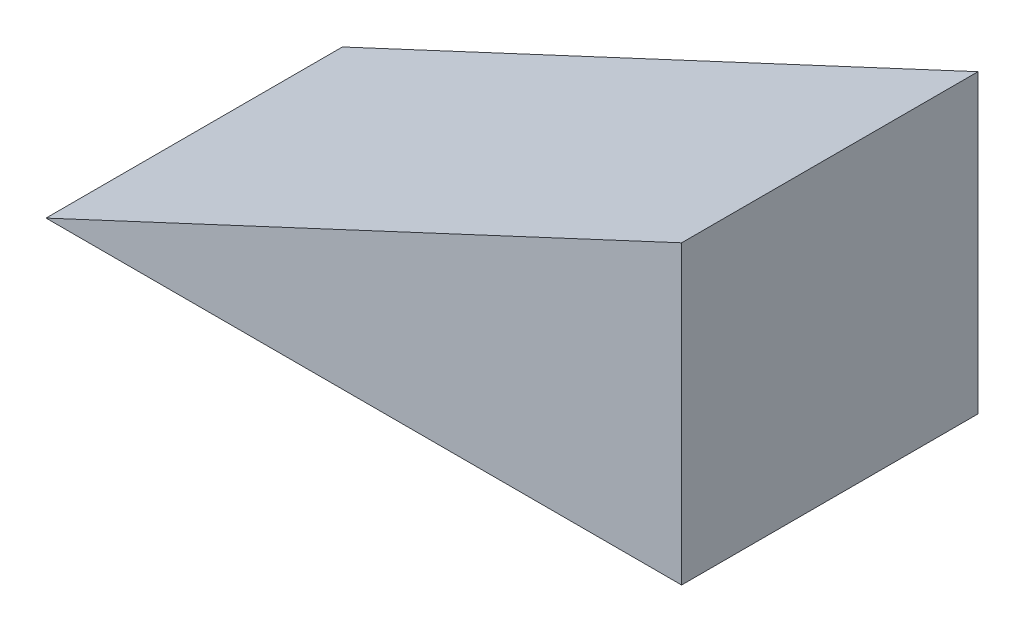
ISO-10303-21;
HEADER;
FILE_DESCRIPTION(('STEP AP214'),'2;1');
FILE_NAME('part.step','',(''),(''),'','','');
FILE_SCHEMA(('AUTOMOTIVE_DESIGN { 1 0 10303 214 1 1 1 1 }'));
ENDSEC;
DATA;
#1=APPLICATION_CONTEXT('core data for automotive mechanical design processes');
#2=APPLICATION_PROTOCOL_DEFINITION('international standard','automotive_design',2000,#1);
#3=PRODUCT_CONTEXT('',#1,'mechanical');
#4=PRODUCT('Part','Part','',(#3));
#5=PRODUCT_RELATED_PRODUCT_CATEGORY('part','',(#4));
#6=PRODUCT_DEFINITION_FORMATION('','',#4);
#7=PRODUCT_DEFINITION_CONTEXT('part definition',#1,'design');
#8=PRODUCT_DEFINITION('design','',#6,#7);
#9=PRODUCT_DEFINITION_SHAPE('','',#8);
#10=(LENGTH_UNIT() NAMED_UNIT(*) SI_UNIT(.MILLI.,.METRE.));
#11=(NAMED_UNIT(*) PLANE_ANGLE_UNIT() SI_UNIT($,.RADIAN.));
#12=(NAMED_UNIT(*) SI_UNIT($,.STERADIAN.) SOLID_ANGLE_UNIT());
#13=UNCERTAINTY_MEASURE_WITH_UNIT(LENGTH_MEASURE(1.E-05),#10,'distance_accuracy_value','');
#14=(GEOMETRIC_REPRESENTATION_CONTEXT(3) GLOBAL_UNCERTAINTY_ASSIGNED_CONTEXT((#13)) GLOBAL_UNIT_ASSIGNED_CONTEXT((#10,
#11,#12)) REPRESENTATION_CONTEXT('',''));
#15=CARTESIAN_POINT('',(0.,0.,0.));
#16=DIRECTION('',(0.,0.,1.));
#17=DIRECTION('',(1.,0.,0.));
#18=AXIS2_PLACEMENT_3D('',#15,#16,#17);
#19=CARTESIAN_POINT('',(35.2838127577754,3.14975774243407,20.));
#20=DIRECTION('',(0.,1.,0.));
#21=DIRECTION('',(-1.,0.,0.));
#22=AXIS2_PLACEMENT_3D('',#19,#20,#21);
#23=PLANE('',#22);
#24=DIRECTION('',(1.,0.,0.));
#25=VECTOR('',#24,1.);
#26=CARTESIAN_POINT('',(35.2838127577754,3.14975774243407,0.));
#27=LINE('',#26,#25);
#28=CARTESIAN_POINT('',(-7.6063256524165,3.14975774243406,0.));
#29=VERTEX_POINT('',#28);
#30=CARTESIAN_POINT('',(35.2838127577754,3.14975774243407,0.));
#31=VERTEX_POINT('',#30);
#32=EDGE_CURVE('E89',#29,#31,#27,.T.);
#33=ORIENTED_EDGE('',*,*,#32,.T.);
#34=DIRECTION('',(0.,0.,-1.));
#35=VECTOR('',#34,1.);
#36=CARTESIAN_POINT('',(35.2838127577754,3.14975774243407,20.));
#37=LINE('',#36,#35);
#38=CARTESIAN_POINT('',(35.2838127577754,3.14975774243407,20.));
#39=VERTEX_POINT('',#38);
#40=EDGE_CURVE('E11',#39,#31,#37,.T.);
#41=ORIENTED_EDGE('',*,*,#40,.F.);
#42=DIRECTION('',(1.,0.,0.));
#43=VECTOR('',#42,1.);
#44=CARTESIAN_POINT('',(35.2838127577754,3.14975774243407,20.));
#45=LINE('',#44,#43);
#46=CARTESIAN_POINT('',(-7.6063256524165,3.14975774243406,20.));
#47=VERTEX_POINT('',#46);
#48=EDGE_CURVE('E81',#47,#39,#45,.T.);
#49=ORIENTED_EDGE('',*,*,#48,.F.);
#50=DIRECTION('',(0.,0.,-1.));
#51=VECTOR('',#50,1.);
#52=CARTESIAN_POINT('',(-7.6063256524165,3.14975774243406,20.));
#53=LINE('',#52,#51);
#54=EDGE_CURVE('E90',#47,#29,#53,.T.);
#55=ORIENTED_EDGE('',*,*,#54,.T.);
#56=EDGE_LOOP('',(#33,#41,#49,#55));
#57=FACE_BOUND('',#56,.T.);
#58=ADVANCED_FACE('F39',(#57),#23,.F.);
#59=CARTESIAN_POINT('',(35.2838127577754,23.1497577424341,20.));
#60=DIRECTION('',(-1.,0.,0.));
#61=DIRECTION('',(0.,-1.,0.));
#62=AXIS2_PLACEMENT_3D('',#59,#60,#61);
#63=PLANE('',#62);
#64=DIRECTION('',(0.,1.,0.));
#65=VECTOR('',#64,1.);
#66=CARTESIAN_POINT('',(35.2838127577754,23.1497577424341,0.));
#67=LINE('',#66,#65);
#68=CARTESIAN_POINT('',(35.2838127577754,23.1497577424341,0.));
#69=VERTEX_POINT('',#68);
#70=EDGE_CURVE('E68',#31,#69,#67,.T.);
#71=ORIENTED_EDGE('',*,*,#70,.T.);
#72=DIRECTION('',(0.,0.,-1.));
#73=VECTOR('',#72,1.);
#74=CARTESIAN_POINT('',(35.2838127577754,23.1497577424341,20.));
#75=LINE('',#74,#73);
#76=CARTESIAN_POINT('',(35.2838127577754,23.1497577424341,20.));
#77=VERTEX_POINT('',#76);
#78=EDGE_CURVE('E48',#77,#69,#75,.T.);
#79=ORIENTED_EDGE('',*,*,#78,.F.);
#80=DIRECTION('',(0.,1.,0.));
#81=VECTOR('',#80,1.);
#82=CARTESIAN_POINT('',(35.2838127577754,23.1497577424341,20.));
#83=LINE('',#82,#81);
#84=EDGE_CURVE('E76',#39,#77,#83,.T.);
#85=ORIENTED_EDGE('',*,*,#84,.F.);
#86=ORIENTED_EDGE('',*,*,#40,.T.);
#87=EDGE_LOOP('',(#71,#79,#85,#86));
#88=FACE_BOUND('',#87,.T.);
#89=ADVANCED_FACE('F77',(#88),#63,.F.);
#90=CARTESIAN_POINT('',(-7.6063256524165,3.14975774243406,20.));
#91=DIRECTION('',(0.422618261740694,-0.906307787036652,0.));
#92=DIRECTION('',(0.906307787036652,0.422618261740694,0.));
#93=AXIS2_PLACEMENT_3D('',#90,#91,#92);
#94=PLANE('',#93);
#95=DIRECTION('',(-0.906307787036652,-0.422618261740694,0.));
#96=VECTOR('',#95,1.);
#97=CARTESIAN_POINT('',(-7.6063256524165,3.14975774243406,0.));
#98=LINE('',#97,#96);
#99=EDGE_CURVE('E73',#69,#29,#98,.T.);
#100=ORIENTED_EDGE('',*,*,#99,.T.);
#101=ORIENTED_EDGE('',*,*,#54,.F.);
#102=DIRECTION('',(-0.906307787036652,-0.422618261740694,0.));
#103=VECTOR('',#102,1.);
#104=CARTESIAN_POINT('',(-7.6063256524165,3.14975774243406,20.));
#105=LINE('',#104,#103);
#106=EDGE_CURVE('E56',#77,#47,#105,.T.);
#107=ORIENTED_EDGE('',*,*,#106,.F.);
#108=ORIENTED_EDGE('',*,*,#78,.T.);
#109=EDGE_LOOP('',(#100,#101,#107,#108));
#110=FACE_BOUND('',#109,.T.);
#111=ADVANCED_FACE('F102',(#110),#94,.F.);
#112=CARTESIAN_POINT('',(0.,0.,20.));
#113=DIRECTION('',(0.,0.,1.));
#114=DIRECTION('',(1.,0.,0.));
#115=AXIS2_PLACEMENT_3D('',#112,#113,#114);
#116=PLANE('',#115);
#117=ORIENTED_EDGE('',*,*,#48,.T.);
#118=ORIENTED_EDGE('',*,*,#84,.T.);
#119=ORIENTED_EDGE('',*,*,#106,.T.);
#120=EDGE_LOOP('',(#117,#118,#119));
#121=FACE_BOUND('',#120,.T.);
#122=ADVANCED_FACE('F84',(#121),#116,.T.);
#123=CARTESIAN_POINT('',(0.,0.,0.));
#124=DIRECTION('',(0.,0.,1.));
#125=DIRECTION('',(1.,0.,0.));
#126=AXIS2_PLACEMENT_3D('',#123,#124,#125);
#127=PLANE('',#126);
#128=ORIENTED_EDGE('',*,*,#32,.F.);
#129=ORIENTED_EDGE('',*,*,#99,.F.);
#130=ORIENTED_EDGE('',*,*,#70,.F.);
#131=EDGE_LOOP('',(#128,#129,#130));
#132=FACE_BOUND('',#131,.T.);
#133=ADVANCED_FACE('F103',(#132),#127,.F.);
#134=CLOSED_SHELL('',(#58,#89,#111,#122,#133));
#135=MANIFOLD_SOLID_BREP('B2',#134);
#136=ADVANCED_BREP_SHAPE_REPRESENTATION('',(#18,#135),#14);
#137=SHAPE_DEFINITION_REPRESENTATION(#9,#136);
ENDSEC;
END-ISO-10303-21;
